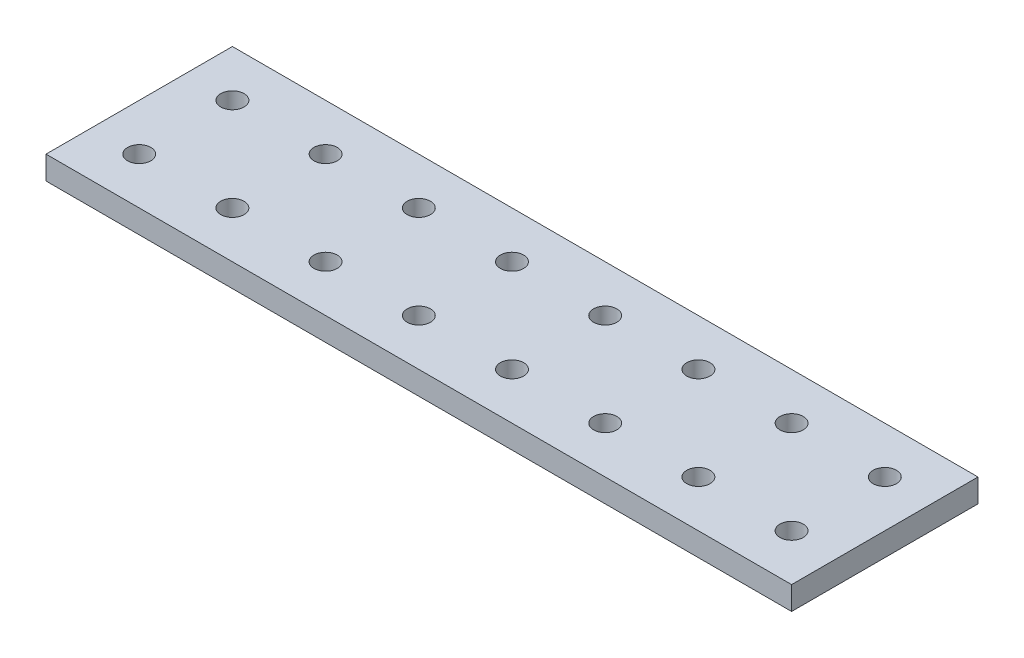
ISO-10303-21;
HEADER;
FILE_DESCRIPTION(('STEP AP214'),'2;1');
FILE_NAME('part.step','',(''),(''),'','','');
FILE_SCHEMA(('AUTOMOTIVE_DESIGN { 1 0 10303 214 1 1 1 1 }'));
ENDSEC;
DATA;
#1=APPLICATION_CONTEXT('core data for automotive mechanical design processes');
#2=APPLICATION_PROTOCOL_DEFINITION('international standard','automotive_design',2000,#1);
#3=PRODUCT_CONTEXT('',#1,'mechanical');
#4=PRODUCT('Part','Part','',(#3));
#5=PRODUCT_RELATED_PRODUCT_CATEGORY('part','',(#4));
#6=PRODUCT_DEFINITION_FORMATION('','',#4);
#7=PRODUCT_DEFINITION_CONTEXT('part definition',#1,'design');
#8=PRODUCT_DEFINITION('design','',#6,#7);
#9=PRODUCT_DEFINITION_SHAPE('','',#8);
#10=(LENGTH_UNIT() NAMED_UNIT(*) SI_UNIT(.MILLI.,.METRE.));
#11=(NAMED_UNIT(*) PLANE_ANGLE_UNIT() SI_UNIT($,.RADIAN.));
#12=(NAMED_UNIT(*) SI_UNIT($,.STERADIAN.) SOLID_ANGLE_UNIT());
#13=UNCERTAINTY_MEASURE_WITH_UNIT(LENGTH_MEASURE(1.E-05),#10,'distance_accuracy_value','');
#14=(GEOMETRIC_REPRESENTATION_CONTEXT(3) GLOBAL_UNCERTAINTY_ASSIGNED_CONTEXT((#13)) GLOBAL_UNIT_ASSIGNED_CONTEXT((#10,
#11,#12)) REPRESENTATION_CONTEXT('',''));
#15=CARTESIAN_POINT('',(0.,0.,0.));
#16=DIRECTION('',(0.,0.,1.));
#17=DIRECTION('',(1.,0.,0.));
#18=AXIS2_PLACEMENT_3D('',#15,#16,#17);
#19=CARTESIAN_POINT('',(0.,6.35,0.));
#20=DIRECTION('',(0.,-1.,0.));
#21=DIRECTION('',(0.,0.,-1.));
#22=AXIS2_PLACEMENT_3D('',#19,#20,#21);
#23=PLANE('',#22);
#24=DIRECTION('',(0.,0.,-1.));
#25=VECTOR('',#24,1.);
#26=CARTESIAN_POINT('',(101.6,6.35,25.4));
#27=LINE('',#26,#25);
#28=CARTESIAN_POINT('',(101.6,6.35,25.4));
#29=VERTEX_POINT('',#28);
#30=CARTESIAN_POINT('',(101.6,6.35,-25.4));
#31=VERTEX_POINT('',#30);
#32=EDGE_CURVE('E87',#29,#31,#27,.T.);
#33=ORIENTED_EDGE('',*,*,#32,.T.);
#34=DIRECTION('',(-1.,0.,0.));
#35=VECTOR('',#34,1.);
#36=CARTESIAN_POINT('',(-101.6,6.35,-25.4));
#37=LINE('',#36,#35);
#38=CARTESIAN_POINT('',(-101.6,6.35,-25.4));
#39=VERTEX_POINT('',#38);
#40=EDGE_CURVE('E82',#31,#39,#37,.T.);
#41=ORIENTED_EDGE('',*,*,#40,.T.);
#42=DIRECTION('',(0.,0.,1.));
#43=VECTOR('',#42,1.);
#44=CARTESIAN_POINT('',(-101.6,6.35,25.4));
#45=LINE('',#44,#43);
#46=CARTESIAN_POINT('',(-101.6,6.35,25.4));
#47=VERTEX_POINT('',#46);
#48=EDGE_CURVE('E85',#39,#47,#45,.T.);
#49=ORIENTED_EDGE('',*,*,#48,.T.);
#50=DIRECTION('',(1.,0.,0.));
#51=VECTOR('',#50,1.);
#52=CARTESIAN_POINT('',(-101.6,6.35,25.4));
#53=LINE('',#52,#51);
#54=EDGE_CURVE('E52',#47,#29,#53,.T.);
#55=ORIENTED_EDGE('',*,*,#54,.T.);
#56=EDGE_LOOP('',(#33,#41,#49,#55));
#57=FACE_BOUND('',#56,.T.);
#58=CARTESIAN_POINT('',(-88.9,6.35,-12.7));
#59=DIRECTION('',(0.,1.,0.));
#60=DIRECTION('',(0.,0.,1.));
#61=AXIS2_PLACEMENT_3D('',#58,#59,#60);
#62=CIRCLE('',#61,3.175);
#63=CARTESIAN_POINT('',(-88.9,6.35,-9.525));
#64=VERTEX_POINT('',#63);
#65=EDGE_CURVE('E102',#64,#64,#62,.T.);
#66=ORIENTED_EDGE('',*,*,#65,.F.);
#67=EDGE_LOOP('',(#66));
#68=FACE_BOUND('',#67,.T.);
#69=CARTESIAN_POINT('',(-63.5,6.35,-12.7));
#70=DIRECTION('',(0.,1.,0.));
#71=DIRECTION('',(0.,0.,1.));
#72=AXIS2_PLACEMENT_3D('',#69,#70,#71);
#73=CIRCLE('',#72,3.17499999999999);
#74=CARTESIAN_POINT('',(-63.5,6.35,-9.52500000000001));
#75=VERTEX_POINT('',#74);
#76=EDGE_CURVE('E117',#75,#75,#73,.T.);
#77=ORIENTED_EDGE('',*,*,#76,.F.);
#78=EDGE_LOOP('',(#77));
#79=FACE_BOUND('',#78,.T.);
#80=CARTESIAN_POINT('',(-38.1,6.35,-12.7));
#81=DIRECTION('',(0.,1.,0.));
#82=DIRECTION('',(0.,0.,1.));
#83=AXIS2_PLACEMENT_3D('',#80,#81,#82);
#84=CIRCLE('',#83,3.175);
#85=CARTESIAN_POINT('',(-38.1,6.35,-9.525));
#86=VERTEX_POINT('',#85);
#87=EDGE_CURVE('E123',#86,#86,#84,.T.);
#88=ORIENTED_EDGE('',*,*,#87,.F.);
#89=EDGE_LOOP('',(#88));
#90=FACE_BOUND('',#89,.T.);
#91=CARTESIAN_POINT('',(-12.7,6.35,-12.7));
#92=DIRECTION('',(0.,1.,0.));
#93=DIRECTION('',(0.,0.,1.));
#94=AXIS2_PLACEMENT_3D('',#91,#92,#93);
#95=CIRCLE('',#94,3.175);
#96=CARTESIAN_POINT('',(-12.7,6.35,-9.525));
#97=VERTEX_POINT('',#96);
#98=EDGE_CURVE('E129',#97,#97,#95,.T.);
#99=ORIENTED_EDGE('',*,*,#98,.F.);
#100=EDGE_LOOP('',(#99));
#101=FACE_BOUND('',#100,.T.);
#102=CARTESIAN_POINT('',(12.7,6.35,-12.7));
#103=DIRECTION('',(0.,1.,0.));
#104=DIRECTION('',(0.,0.,1.));
#105=AXIS2_PLACEMENT_3D('',#102,#103,#104);
#106=CIRCLE('',#105,3.175);
#107=CARTESIAN_POINT('',(12.7,6.35,-9.525));
#108=VERTEX_POINT('',#107);
#109=EDGE_CURVE('E135',#108,#108,#106,.T.);
#110=ORIENTED_EDGE('',*,*,#109,.F.);
#111=EDGE_LOOP('',(#110));
#112=FACE_BOUND('',#111,.T.);
#113=CARTESIAN_POINT('',(38.1,6.35,-12.7));
#114=DIRECTION('',(0.,1.,0.));
#115=DIRECTION('',(0.,0.,1.));
#116=AXIS2_PLACEMENT_3D('',#113,#114,#115);
#117=CIRCLE('',#116,3.175);
#118=CARTESIAN_POINT('',(38.1,6.35,-9.525));
#119=VERTEX_POINT('',#118);
#120=EDGE_CURVE('E141',#119,#119,#117,.T.);
#121=ORIENTED_EDGE('',*,*,#120,.F.);
#122=EDGE_LOOP('',(#121));
#123=FACE_BOUND('',#122,.T.);
#124=CARTESIAN_POINT('',(63.5,6.35,-12.7));
#125=DIRECTION('',(0.,1.,0.));
#126=DIRECTION('',(0.,0.,1.));
#127=AXIS2_PLACEMENT_3D('',#124,#125,#126);
#128=CIRCLE('',#127,3.175);
#129=CARTESIAN_POINT('',(63.5,6.35,-9.525));
#130=VERTEX_POINT('',#129);
#131=EDGE_CURVE('E147',#130,#130,#128,.T.);
#132=ORIENTED_EDGE('',*,*,#131,.F.);
#133=EDGE_LOOP('',(#132));
#134=FACE_BOUND('',#133,.T.);
#135=CARTESIAN_POINT('',(88.9,6.35,-12.7));
#136=DIRECTION('',(0.,1.,0.));
#137=DIRECTION('',(0.,0.,1.));
#138=AXIS2_PLACEMENT_3D('',#135,#136,#137);
#139=CIRCLE('',#138,3.175);
#140=CARTESIAN_POINT('',(88.9,6.35,-9.525));
#141=VERTEX_POINT('',#140);
#142=EDGE_CURVE('E153',#141,#141,#139,.T.);
#143=ORIENTED_EDGE('',*,*,#142,.F.);
#144=EDGE_LOOP('',(#143));
#145=FACE_BOUND('',#144,.T.);
#146=CARTESIAN_POINT('',(-63.4999999999997,6.35,12.7));
#147=DIRECTION('',(0.,1.,0.));
#148=DIRECTION('',(0.,0.,1.));
#149=AXIS2_PLACEMENT_3D('',#146,#147,#148);
#150=CIRCLE('',#149,3.175);
#151=CARTESIAN_POINT('',(-63.4999999999997,6.35,15.875));
#152=VERTEX_POINT('',#151);
#153=EDGE_CURVE('E159',#152,#152,#150,.T.);
#154=ORIENTED_EDGE('',*,*,#153,.F.);
#155=EDGE_LOOP('',(#154));
#156=FACE_BOUND('',#155,.T.);
#157=CARTESIAN_POINT('',(-38.0999999999997,6.35,12.7));
#158=DIRECTION('',(0.,1.,0.));
#159=DIRECTION('',(0.,0.,1.));
#160=AXIS2_PLACEMENT_3D('',#157,#158,#159);
#161=CIRCLE('',#160,3.175);
#162=CARTESIAN_POINT('',(-38.0999999999997,6.35,15.875));
#163=VERTEX_POINT('',#162);
#164=EDGE_CURVE('E165',#163,#163,#161,.T.);
#165=ORIENTED_EDGE('',*,*,#164,.F.);
#166=EDGE_LOOP('',(#165));
#167=FACE_BOUND('',#166,.T.);
#168=CARTESIAN_POINT('',(-12.6999999999998,6.35,12.7));
#169=DIRECTION('',(0.,1.,0.));
#170=DIRECTION('',(0.,0.,1.));
#171=AXIS2_PLACEMENT_3D('',#168,#169,#170);
#172=CIRCLE('',#171,3.175);
#173=CARTESIAN_POINT('',(-12.6999999999998,6.35,15.875));
#174=VERTEX_POINT('',#173);
#175=EDGE_CURVE('E171',#174,#174,#172,.T.);
#176=ORIENTED_EDGE('',*,*,#175,.F.);
#177=EDGE_LOOP('',(#176));
#178=FACE_BOUND('',#177,.T.);
#179=CARTESIAN_POINT('',(12.7000000000003,6.35,12.7));
#180=DIRECTION('',(0.,1.,0.));
#181=DIRECTION('',(0.,0.,1.));
#182=AXIS2_PLACEMENT_3D('',#179,#180,#181);
#183=CIRCLE('',#182,3.175);
#184=CARTESIAN_POINT('',(12.7000000000003,6.35,15.875));
#185=VERTEX_POINT('',#184);
#186=EDGE_CURVE('E177',#185,#185,#183,.T.);
#187=ORIENTED_EDGE('',*,*,#186,.F.);
#188=EDGE_LOOP('',(#187));
#189=FACE_BOUND('',#188,.T.);
#190=CARTESIAN_POINT('',(38.1000000000003,6.35,12.7));
#191=DIRECTION('',(0.,1.,0.));
#192=DIRECTION('',(0.,0.,1.));
#193=AXIS2_PLACEMENT_3D('',#190,#191,#192);
#194=CIRCLE('',#193,3.175);
#195=CARTESIAN_POINT('',(38.1000000000003,6.35,15.875));
#196=VERTEX_POINT('',#195);
#197=EDGE_CURVE('E183',#196,#196,#194,.T.);
#198=ORIENTED_EDGE('',*,*,#197,.F.);
#199=EDGE_LOOP('',(#198));
#200=FACE_BOUND('',#199,.T.);
#201=CARTESIAN_POINT('',(63.5000000000002,6.35,12.7));
#202=DIRECTION('',(0.,1.,0.));
#203=DIRECTION('',(0.,0.,1.));
#204=AXIS2_PLACEMENT_3D('',#201,#202,#203);
#205=CIRCLE('',#204,3.175);
#206=CARTESIAN_POINT('',(63.5000000000002,6.35,15.875));
#207=VERTEX_POINT('',#206);
#208=EDGE_CURVE('E189',#207,#207,#205,.T.);
#209=ORIENTED_EDGE('',*,*,#208,.F.);
#210=EDGE_LOOP('',(#209));
#211=FACE_BOUND('',#210,.T.);
#212=CARTESIAN_POINT('',(88.9000000000003,6.35,12.7));
#213=DIRECTION('',(0.,1.,0.));
#214=DIRECTION('',(0.,0.,1.));
#215=AXIS2_PLACEMENT_3D('',#212,#213,#214);
#216=CIRCLE('',#215,3.175);
#217=CARTESIAN_POINT('',(88.9000000000003,6.35,15.875));
#218=VERTEX_POINT('',#217);
#219=EDGE_CURVE('E195',#218,#218,#216,.T.);
#220=ORIENTED_EDGE('',*,*,#219,.F.);
#221=EDGE_LOOP('',(#220));
#222=FACE_BOUND('',#221,.T.);
#223=CARTESIAN_POINT('',(-88.8999999999997,6.35,12.7));
#224=DIRECTION('',(0.,1.,0.));
#225=DIRECTION('',(0.,0.,1.));
#226=AXIS2_PLACEMENT_3D('',#223,#224,#225);
#227=CIRCLE('',#226,3.175);
#228=CARTESIAN_POINT('',(-88.8999999999997,6.35,15.875));
#229=VERTEX_POINT('',#228);
#230=EDGE_CURVE('E201',#229,#229,#227,.T.);
#231=ORIENTED_EDGE('',*,*,#230,.F.);
#232=EDGE_LOOP('',(#231));
#233=FACE_BOUND('',#232,.T.);
#234=ADVANCED_FACE('F35',(#57,#68,#79,#90,#101,#112,#123,#134,#145,#156,#167,#178,#189,#200,
#211,#222,#233),#23,.F.);
#235=CARTESIAN_POINT('',(0.,0.,0.));
#236=DIRECTION('',(0.,-1.,0.));
#237=DIRECTION('',(0.,0.,-1.));
#238=AXIS2_PLACEMENT_3D('',#235,#236,#237);
#239=PLANE('',#238);
#240=CARTESIAN_POINT('',(88.9000000000003,0.,12.7));
#241=DIRECTION('',(0.,1.,0.));
#242=DIRECTION('',(0.,0.,1.));
#243=AXIS2_PLACEMENT_3D('',#240,#241,#242);
#244=CIRCLE('',#243,3.175);
#245=CARTESIAN_POINT('',(88.9000000000003,0.,15.875));
#246=VERTEX_POINT('',#245);
#247=EDGE_CURVE('E198',#246,#246,#244,.T.);
#248=ORIENTED_EDGE('',*,*,#247,.T.);
#249=EDGE_LOOP('',(#248));
#250=FACE_BOUND('',#249,.T.);
#251=CARTESIAN_POINT('',(38.1000000000003,0.,12.7));
#252=DIRECTION('',(0.,1.,0.));
#253=DIRECTION('',(0.,0.,1.));
#254=AXIS2_PLACEMENT_3D('',#251,#252,#253);
#255=CIRCLE('',#254,3.175);
#256=CARTESIAN_POINT('',(38.1000000000003,0.,15.875));
#257=VERTEX_POINT('',#256);
#258=EDGE_CURVE('E186',#257,#257,#255,.T.);
#259=ORIENTED_EDGE('',*,*,#258,.T.);
#260=EDGE_LOOP('',(#259));
#261=FACE_BOUND('',#260,.T.);
#262=CARTESIAN_POINT('',(-12.6999999999998,0.,12.7));
#263=DIRECTION('',(0.,1.,0.));
#264=DIRECTION('',(0.,0.,1.));
#265=AXIS2_PLACEMENT_3D('',#262,#263,#264);
#266=CIRCLE('',#265,3.175);
#267=CARTESIAN_POINT('',(-12.6999999999998,0.,15.875));
#268=VERTEX_POINT('',#267);
#269=EDGE_CURVE('E174',#268,#268,#266,.T.);
#270=ORIENTED_EDGE('',*,*,#269,.T.);
#271=EDGE_LOOP('',(#270));
#272=FACE_BOUND('',#271,.T.);
#273=CARTESIAN_POINT('',(-63.4999999999997,0.,12.7));
#274=DIRECTION('',(0.,1.,0.));
#275=DIRECTION('',(0.,0.,1.));
#276=AXIS2_PLACEMENT_3D('',#273,#274,#275);
#277=CIRCLE('',#276,3.175);
#278=CARTESIAN_POINT('',(-63.4999999999997,0.,15.875));
#279=VERTEX_POINT('',#278);
#280=EDGE_CURVE('E162',#279,#279,#277,.T.);
#281=ORIENTED_EDGE('',*,*,#280,.T.);
#282=EDGE_LOOP('',(#281));
#283=FACE_BOUND('',#282,.T.);
#284=CARTESIAN_POINT('',(63.5,0.,-12.7));
#285=DIRECTION('',(0.,1.,0.));
#286=DIRECTION('',(0.,0.,1.));
#287=AXIS2_PLACEMENT_3D('',#284,#285,#286);
#288=CIRCLE('',#287,3.175);
#289=CARTESIAN_POINT('',(63.5,0.,-9.525));
#290=VERTEX_POINT('',#289);
#291=EDGE_CURVE('E150',#290,#290,#288,.T.);
#292=ORIENTED_EDGE('',*,*,#291,.T.);
#293=EDGE_LOOP('',(#292));
#294=FACE_BOUND('',#293,.T.);
#295=CARTESIAN_POINT('',(12.7,0.,-12.7));
#296=DIRECTION('',(0.,1.,0.));
#297=DIRECTION('',(0.,0.,1.));
#298=AXIS2_PLACEMENT_3D('',#295,#296,#297);
#299=CIRCLE('',#298,3.175);
#300=CARTESIAN_POINT('',(12.7,0.,-9.525));
#301=VERTEX_POINT('',#300);
#302=EDGE_CURVE('E138',#301,#301,#299,.T.);
#303=ORIENTED_EDGE('',*,*,#302,.T.);
#304=EDGE_LOOP('',(#303));
#305=FACE_BOUND('',#304,.T.);
#306=CARTESIAN_POINT('',(-38.1,0.,-12.7));
#307=DIRECTION('',(0.,1.,0.));
#308=DIRECTION('',(0.,0.,1.));
#309=AXIS2_PLACEMENT_3D('',#306,#307,#308);
#310=CIRCLE('',#309,3.175);
#311=CARTESIAN_POINT('',(-38.1,0.,-9.525));
#312=VERTEX_POINT('',#311);
#313=EDGE_CURVE('E126',#312,#312,#310,.T.);
#314=ORIENTED_EDGE('',*,*,#313,.T.);
#315=EDGE_LOOP('',(#314));
#316=FACE_BOUND('',#315,.T.);
#317=CARTESIAN_POINT('',(-88.9,0.,-12.7));
#318=DIRECTION('',(0.,1.,0.));
#319=DIRECTION('',(0.,0.,1.));
#320=AXIS2_PLACEMENT_3D('',#317,#318,#319);
#321=CIRCLE('',#320,3.175);
#322=CARTESIAN_POINT('',(-88.9,0.,-9.525));
#323=VERTEX_POINT('',#322);
#324=EDGE_CURVE('E114',#323,#323,#321,.T.);
#325=ORIENTED_EDGE('',*,*,#324,.T.);
#326=EDGE_LOOP('',(#325));
#327=FACE_BOUND('',#326,.T.);
#328=DIRECTION('',(0.,0.,-1.));
#329=VECTOR('',#328,1.);
#330=CARTESIAN_POINT('',(101.6,0.,25.4));
#331=LINE('',#330,#329);
#332=CARTESIAN_POINT('',(101.6,0.,25.4));
#333=VERTEX_POINT('',#332);
#334=CARTESIAN_POINT('',(101.6,0.,-25.4));
#335=VERTEX_POINT('',#334);
#336=EDGE_CURVE('E99',#333,#335,#331,.T.);
#337=ORIENTED_EDGE('',*,*,#336,.F.);
#338=DIRECTION('',(1.,0.,0.));
#339=VECTOR('',#338,1.);
#340=CARTESIAN_POINT('',(-101.6,0.,25.4));
#341=LINE('',#340,#339);
#342=CARTESIAN_POINT('',(-101.6,0.,25.4));
#343=VERTEX_POINT('',#342);
#344=EDGE_CURVE('E75',#343,#333,#341,.T.);
#345=ORIENTED_EDGE('',*,*,#344,.F.);
#346=DIRECTION('',(0.,0.,1.));
#347=VECTOR('',#346,1.);
#348=CARTESIAN_POINT('',(-101.6,0.,25.4));
#349=LINE('',#348,#347);
#350=CARTESIAN_POINT('',(-101.6,0.,-25.4));
#351=VERTEX_POINT('',#350);
#352=EDGE_CURVE('E69',#351,#343,#349,.T.);
#353=ORIENTED_EDGE('',*,*,#352,.F.);
#354=DIRECTION('',(-1.,0.,0.));
#355=VECTOR('',#354,1.);
#356=CARTESIAN_POINT('',(-101.6,0.,-25.4));
#357=LINE('',#356,#355);
#358=EDGE_CURVE('E91',#335,#351,#357,.T.);
#359=ORIENTED_EDGE('',*,*,#358,.F.);
#360=EDGE_LOOP('',(#337,#345,#353,#359));
#361=FACE_BOUND('',#360,.T.);
#362=CARTESIAN_POINT('',(-63.5,0.,-12.7));
#363=DIRECTION('',(0.,1.,0.));
#364=DIRECTION('',(0.,0.,1.));
#365=AXIS2_PLACEMENT_3D('',#362,#363,#364);
#366=CIRCLE('',#365,3.17499999999999);
#367=CARTESIAN_POINT('',(-63.5,0.,-9.52500000000001));
#368=VERTEX_POINT('',#367);
#369=EDGE_CURVE('E120',#368,#368,#366,.T.);
#370=ORIENTED_EDGE('',*,*,#369,.T.);
#371=EDGE_LOOP('',(#370));
#372=FACE_BOUND('',#371,.T.);
#373=CARTESIAN_POINT('',(-12.7,0.,-12.7));
#374=DIRECTION('',(0.,1.,0.));
#375=DIRECTION('',(0.,0.,1.));
#376=AXIS2_PLACEMENT_3D('',#373,#374,#375);
#377=CIRCLE('',#376,3.175);
#378=CARTESIAN_POINT('',(-12.7,0.,-9.525));
#379=VERTEX_POINT('',#378);
#380=EDGE_CURVE('E132',#379,#379,#377,.T.);
#381=ORIENTED_EDGE('',*,*,#380,.T.);
#382=EDGE_LOOP('',(#381));
#383=FACE_BOUND('',#382,.T.);
#384=CARTESIAN_POINT('',(38.1,0.,-12.7));
#385=DIRECTION('',(0.,1.,0.));
#386=DIRECTION('',(0.,0.,1.));
#387=AXIS2_PLACEMENT_3D('',#384,#385,#386);
#388=CIRCLE('',#387,3.175);
#389=CARTESIAN_POINT('',(38.1,0.,-9.525));
#390=VERTEX_POINT('',#389);
#391=EDGE_CURVE('E144',#390,#390,#388,.T.);
#392=ORIENTED_EDGE('',*,*,#391,.T.);
#393=EDGE_LOOP('',(#392));
#394=FACE_BOUND('',#393,.T.);
#395=CARTESIAN_POINT('',(88.9,0.,-12.7));
#396=DIRECTION('',(0.,1.,0.));
#397=DIRECTION('',(0.,0.,1.));
#398=AXIS2_PLACEMENT_3D('',#395,#396,#397);
#399=CIRCLE('',#398,3.175);
#400=CARTESIAN_POINT('',(88.9,0.,-9.525));
#401=VERTEX_POINT('',#400);
#402=EDGE_CURVE('E156',#401,#401,#399,.T.);
#403=ORIENTED_EDGE('',*,*,#402,.T.);
#404=EDGE_LOOP('',(#403));
#405=FACE_BOUND('',#404,.T.);
#406=CARTESIAN_POINT('',(-38.0999999999997,0.,12.7));
#407=DIRECTION('',(0.,1.,0.));
#408=DIRECTION('',(0.,0.,1.));
#409=AXIS2_PLACEMENT_3D('',#406,#407,#408);
#410=CIRCLE('',#409,3.175);
#411=CARTESIAN_POINT('',(-38.0999999999997,0.,15.875));
#412=VERTEX_POINT('',#411);
#413=EDGE_CURVE('E168',#412,#412,#410,.T.);
#414=ORIENTED_EDGE('',*,*,#413,.T.);
#415=EDGE_LOOP('',(#414));
#416=FACE_BOUND('',#415,.T.);
#417=CARTESIAN_POINT('',(12.7000000000003,0.,12.7));
#418=DIRECTION('',(0.,1.,0.));
#419=DIRECTION('',(0.,0.,1.));
#420=AXIS2_PLACEMENT_3D('',#417,#418,#419);
#421=CIRCLE('',#420,3.175);
#422=CARTESIAN_POINT('',(12.7000000000003,0.,15.875));
#423=VERTEX_POINT('',#422);
#424=EDGE_CURVE('E180',#423,#423,#421,.T.);
#425=ORIENTED_EDGE('',*,*,#424,.T.);
#426=EDGE_LOOP('',(#425));
#427=FACE_BOUND('',#426,.T.);
#428=CARTESIAN_POINT('',(63.5000000000002,0.,12.7));
#429=DIRECTION('',(0.,1.,0.));
#430=DIRECTION('',(0.,0.,1.));
#431=AXIS2_PLACEMENT_3D('',#428,#429,#430);
#432=CIRCLE('',#431,3.175);
#433=CARTESIAN_POINT('',(63.5000000000002,0.,15.875));
#434=VERTEX_POINT('',#433);
#435=EDGE_CURVE('E192',#434,#434,#432,.T.);
#436=ORIENTED_EDGE('',*,*,#435,.T.);
#437=EDGE_LOOP('',(#436));
#438=FACE_BOUND('',#437,.T.);
#439=CARTESIAN_POINT('',(-88.8999999999997,0.,12.7));
#440=DIRECTION('',(0.,1.,0.));
#441=DIRECTION('',(0.,0.,1.));
#442=AXIS2_PLACEMENT_3D('',#439,#440,#441);
#443=CIRCLE('',#442,3.175);
#444=CARTESIAN_POINT('',(-88.8999999999997,0.,15.875));
#445=VERTEX_POINT('',#444);
#446=EDGE_CURVE('E204',#445,#445,#443,.T.);
#447=ORIENTED_EDGE('',*,*,#446,.T.);
#448=EDGE_LOOP('',(#447));
#449=FACE_BOUND('',#448,.T.);
#450=ADVANCED_FACE('F110',(#250,#261,#272,#283,#294,#305,#316,#327,#361,#372,#383,#394,#405,
#416,#427,#438,#449),#239,.T.);
#451=CARTESIAN_POINT('',(101.6,6.35,25.4));
#452=DIRECTION('',(-1.,0.,0.));
#453=DIRECTION('',(0.,0.,1.));
#454=AXIS2_PLACEMENT_3D('',#451,#452,#453);
#455=PLANE('',#454);
#456=ORIENTED_EDGE('',*,*,#336,.T.);
#457=DIRECTION('',(0.,-1.,0.));
#458=VECTOR('',#457,1.);
#459=CARTESIAN_POINT('',(101.6,6.35,-25.4));
#460=LINE('',#459,#458);
#461=EDGE_CURVE('E11',#31,#335,#460,.T.);
#462=ORIENTED_EDGE('',*,*,#461,.F.);
#463=ORIENTED_EDGE('',*,*,#32,.F.);
#464=DIRECTION('',(0.,-1.,0.));
#465=VECTOR('',#464,1.);
#466=CARTESIAN_POINT('',(101.6,6.35,25.4));
#467=LINE('',#466,#465);
#468=EDGE_CURVE('E95',#29,#333,#467,.T.);
#469=ORIENTED_EDGE('',*,*,#468,.T.);
#470=EDGE_LOOP('',(#456,#462,#463,#469));
#471=FACE_BOUND('',#470,.T.);
#472=ADVANCED_FACE('F37',(#471),#455,.F.);
#473=CARTESIAN_POINT('',(-101.6,6.35,-25.4));
#474=DIRECTION('',(0.,0.,1.));
#475=DIRECTION('',(1.,0.,0.));
#476=AXIS2_PLACEMENT_3D('',#473,#474,#475);
#477=PLANE('',#476);
#478=ORIENTED_EDGE('',*,*,#358,.T.);
#479=DIRECTION('',(0.,-1.,0.));
#480=VECTOR('',#479,1.);
#481=CARTESIAN_POINT('',(-101.6,6.35,-25.4));
#482=LINE('',#481,#480);
#483=EDGE_CURVE('E44',#39,#351,#482,.T.);
#484=ORIENTED_EDGE('',*,*,#483,.F.);
#485=ORIENTED_EDGE('',*,*,#40,.F.);
#486=ORIENTED_EDGE('',*,*,#461,.T.);
#487=EDGE_LOOP('',(#478,#484,#485,#486));
#488=FACE_BOUND('',#487,.T.);
#489=ADVANCED_FACE('F90',(#488),#477,.F.);
#490=CARTESIAN_POINT('',(-101.6,6.35,25.4));
#491=DIRECTION('',(1.,0.,0.));
#492=DIRECTION('',(0.,0.,-1.));
#493=AXIS2_PLACEMENT_3D('',#490,#491,#492);
#494=PLANE('',#493);
#495=ORIENTED_EDGE('',*,*,#352,.T.);
#496=DIRECTION('',(0.,-1.,0.));
#497=VECTOR('',#496,1.);
#498=CARTESIAN_POINT('',(-101.6,6.35,25.4));
#499=LINE('',#498,#497);
#500=EDGE_CURVE('E92',#47,#343,#499,.T.);
#501=ORIENTED_EDGE('',*,*,#500,.F.);
#502=ORIENTED_EDGE('',*,*,#48,.F.);
#503=ORIENTED_EDGE('',*,*,#483,.T.);
#504=EDGE_LOOP('',(#495,#501,#502,#503));
#505=FACE_BOUND('',#504,.T.);
#506=ADVANCED_FACE('F93',(#505),#494,.F.);
#507=CARTESIAN_POINT('',(-101.6,6.35,25.4));
#508=DIRECTION('',(0.,0.,-1.));
#509=DIRECTION('',(-1.,0.,0.));
#510=AXIS2_PLACEMENT_3D('',#507,#508,#509);
#511=PLANE('',#510);
#512=ORIENTED_EDGE('',*,*,#344,.T.);
#513=ORIENTED_EDGE('',*,*,#468,.F.);
#514=ORIENTED_EDGE('',*,*,#54,.F.);
#515=ORIENTED_EDGE('',*,*,#500,.T.);
#516=EDGE_LOOP('',(#512,#513,#514,#515));
#517=FACE_BOUND('',#516,.T.);
#518=ADVANCED_FACE('F107',(#517),#511,.F.);
#519=CARTESIAN_POINT('',(-88.9,6.35,-12.7));
#520=DIRECTION('',(0.,-1.,0.));
#521=DIRECTION('',(0.,0.,-1.));
#522=AXIS2_PLACEMENT_3D('',#519,#520,#521);
#523=CYLINDRICAL_SURFACE('',#522,3.175);
#524=ORIENTED_EDGE('',*,*,#65,.T.);
#525=EDGE_LOOP('',(#524));
#526=FACE_BOUND('',#525,.T.);
#527=ORIENTED_EDGE('',*,*,#324,.F.);
#528=EDGE_LOOP('',(#527));
#529=FACE_BOUND('',#528,.T.);
#530=ADVANCED_FACE('F221',(#526,#529),#523,.F.);
#531=CARTESIAN_POINT('',(-63.5,6.35,-12.7));
#532=DIRECTION('',(0.,-1.,0.));
#533=DIRECTION('',(0.,0.,-1.));
#534=AXIS2_PLACEMENT_3D('',#531,#532,#533);
#535=CYLINDRICAL_SURFACE('',#534,3.17499999999999);
#536=ORIENTED_EDGE('',*,*,#76,.T.);
#537=EDGE_LOOP('',(#536));
#538=FACE_BOUND('',#537,.T.);
#539=ORIENTED_EDGE('',*,*,#369,.F.);
#540=EDGE_LOOP('',(#539));
#541=FACE_BOUND('',#540,.T.);
#542=ADVANCED_FACE('F267',(#538,#541),#535,.F.);
#543=CARTESIAN_POINT('',(-38.1,6.35,-12.7));
#544=DIRECTION('',(0.,-1.,0.));
#545=DIRECTION('',(0.,0.,-1.));
#546=AXIS2_PLACEMENT_3D('',#543,#544,#545);
#547=CYLINDRICAL_SURFACE('',#546,3.175);
#548=ORIENTED_EDGE('',*,*,#87,.T.);
#549=EDGE_LOOP('',(#548));
#550=FACE_BOUND('',#549,.T.);
#551=ORIENTED_EDGE('',*,*,#313,.F.);
#552=EDGE_LOOP('',(#551));
#553=FACE_BOUND('',#552,.T.);
#554=ADVANCED_FACE('F275',(#550,#553),#547,.F.);
#555=CARTESIAN_POINT('',(-12.7,6.35,-12.7));
#556=DIRECTION('',(0.,-1.,0.));
#557=DIRECTION('',(0.,0.,-1.));
#558=AXIS2_PLACEMENT_3D('',#555,#556,#557);
#559=CYLINDRICAL_SURFACE('',#558,3.175);
#560=ORIENTED_EDGE('',*,*,#98,.T.);
#561=EDGE_LOOP('',(#560));
#562=FACE_BOUND('',#561,.T.);
#563=ORIENTED_EDGE('',*,*,#380,.F.);
#564=EDGE_LOOP('',(#563));
#565=FACE_BOUND('',#564,.T.);
#566=ADVANCED_FACE('F283',(#562,#565),#559,.F.);
#567=CARTESIAN_POINT('',(12.7,6.35,-12.7));
#568=DIRECTION('',(0.,-1.,0.));
#569=DIRECTION('',(0.,0.,-1.));
#570=AXIS2_PLACEMENT_3D('',#567,#568,#569);
#571=CYLINDRICAL_SURFACE('',#570,3.175);
#572=ORIENTED_EDGE('',*,*,#109,.T.);
#573=EDGE_LOOP('',(#572));
#574=FACE_BOUND('',#573,.T.);
#575=ORIENTED_EDGE('',*,*,#302,.F.);
#576=EDGE_LOOP('',(#575));
#577=FACE_BOUND('',#576,.T.);
#578=ADVANCED_FACE('F292',(#574,#577),#571,.F.);
#579=CARTESIAN_POINT('',(38.1,6.35,-12.7));
#580=DIRECTION('',(0.,-1.,0.));
#581=DIRECTION('',(0.,0.,-1.));
#582=AXIS2_PLACEMENT_3D('',#579,#580,#581);
#583=CYLINDRICAL_SURFACE('',#582,3.175);
#584=ORIENTED_EDGE('',*,*,#120,.T.);
#585=EDGE_LOOP('',(#584));
#586=FACE_BOUND('',#585,.T.);
#587=ORIENTED_EDGE('',*,*,#391,.F.);
#588=EDGE_LOOP('',(#587));
#589=FACE_BOUND('',#588,.T.);
#590=ADVANCED_FACE('F301',(#586,#589),#583,.F.);
#591=CARTESIAN_POINT('',(63.5,6.35,-12.7));
#592=DIRECTION('',(0.,-1.,0.));
#593=DIRECTION('',(0.,0.,-1.));
#594=AXIS2_PLACEMENT_3D('',#591,#592,#593);
#595=CYLINDRICAL_SURFACE('',#594,3.175);
#596=ORIENTED_EDGE('',*,*,#131,.T.);
#597=EDGE_LOOP('',(#596));
#598=FACE_BOUND('',#597,.T.);
#599=ORIENTED_EDGE('',*,*,#291,.F.);
#600=EDGE_LOOP('',(#599));
#601=FACE_BOUND('',#600,.T.);
#602=ADVANCED_FACE('F310',(#598,#601),#595,.F.);
#603=CARTESIAN_POINT('',(88.9,6.35,-12.7));
#604=DIRECTION('',(0.,-1.,0.));
#605=DIRECTION('',(0.,0.,-1.));
#606=AXIS2_PLACEMENT_3D('',#603,#604,#605);
#607=CYLINDRICAL_SURFACE('',#606,3.175);
#608=ORIENTED_EDGE('',*,*,#142,.T.);
#609=EDGE_LOOP('',(#608));
#610=FACE_BOUND('',#609,.T.);
#611=ORIENTED_EDGE('',*,*,#402,.F.);
#612=EDGE_LOOP('',(#611));
#613=FACE_BOUND('',#612,.T.);
#614=ADVANCED_FACE('F319',(#610,#613),#607,.F.);
#615=CARTESIAN_POINT('',(-63.4999999999997,6.35,12.7));
#616=DIRECTION('',(0.,-1.,0.));
#617=DIRECTION('',(0.,0.,-1.));
#618=AXIS2_PLACEMENT_3D('',#615,#616,#617);
#619=CYLINDRICAL_SURFACE('',#618,3.175);
#620=ORIENTED_EDGE('',*,*,#153,.T.);
#621=EDGE_LOOP('',(#620));
#622=FACE_BOUND('',#621,.T.);
#623=ORIENTED_EDGE('',*,*,#280,.F.);
#624=EDGE_LOOP('',(#623));
#625=FACE_BOUND('',#624,.T.);
#626=ADVANCED_FACE('F328',(#622,#625),#619,.F.);
#627=CARTESIAN_POINT('',(-38.0999999999997,6.35,12.7));
#628=DIRECTION('',(0.,-1.,0.));
#629=DIRECTION('',(0.,0.,-1.));
#630=AXIS2_PLACEMENT_3D('',#627,#628,#629);
#631=CYLINDRICAL_SURFACE('',#630,3.175);
#632=ORIENTED_EDGE('',*,*,#164,.T.);
#633=EDGE_LOOP('',(#632));
#634=FACE_BOUND('',#633,.T.);
#635=ORIENTED_EDGE('',*,*,#413,.F.);
#636=EDGE_LOOP('',(#635));
#637=FACE_BOUND('',#636,.T.);
#638=ADVANCED_FACE('F337',(#634,#637),#631,.F.);
#639=CARTESIAN_POINT('',(-12.6999999999998,6.35,12.7));
#640=DIRECTION('',(0.,-1.,0.));
#641=DIRECTION('',(0.,0.,-1.));
#642=AXIS2_PLACEMENT_3D('',#639,#640,#641);
#643=CYLINDRICAL_SURFACE('',#642,3.175);
#644=ORIENTED_EDGE('',*,*,#175,.T.);
#645=EDGE_LOOP('',(#644));
#646=FACE_BOUND('',#645,.T.);
#647=ORIENTED_EDGE('',*,*,#269,.F.);
#648=EDGE_LOOP('',(#647));
#649=FACE_BOUND('',#648,.T.);
#650=ADVANCED_FACE('F346',(#646,#649),#643,.F.);
#651=CARTESIAN_POINT('',(12.7000000000003,6.35,12.7));
#652=DIRECTION('',(0.,-1.,0.));
#653=DIRECTION('',(0.,0.,-1.));
#654=AXIS2_PLACEMENT_3D('',#651,#652,#653);
#655=CYLINDRICAL_SURFACE('',#654,3.175);
#656=ORIENTED_EDGE('',*,*,#186,.T.);
#657=EDGE_LOOP('',(#656));
#658=FACE_BOUND('',#657,.T.);
#659=ORIENTED_EDGE('',*,*,#424,.F.);
#660=EDGE_LOOP('',(#659));
#661=FACE_BOUND('',#660,.T.);
#662=ADVANCED_FACE('F355',(#658,#661),#655,.F.);
#663=CARTESIAN_POINT('',(38.1000000000003,6.35,12.7));
#664=DIRECTION('',(0.,-1.,0.));
#665=DIRECTION('',(0.,0.,-1.));
#666=AXIS2_PLACEMENT_3D('',#663,#664,#665);
#667=CYLINDRICAL_SURFACE('',#666,3.175);
#668=ORIENTED_EDGE('',*,*,#197,.T.);
#669=EDGE_LOOP('',(#668));
#670=FACE_BOUND('',#669,.T.);
#671=ORIENTED_EDGE('',*,*,#258,.F.);
#672=EDGE_LOOP('',(#671));
#673=FACE_BOUND('',#672,.T.);
#674=ADVANCED_FACE('F364',(#670,#673),#667,.F.);
#675=CARTESIAN_POINT('',(63.5000000000002,6.35,12.7));
#676=DIRECTION('',(0.,-1.,0.));
#677=DIRECTION('',(0.,0.,-1.));
#678=AXIS2_PLACEMENT_3D('',#675,#676,#677);
#679=CYLINDRICAL_SURFACE('',#678,3.175);
#680=ORIENTED_EDGE('',*,*,#208,.T.);
#681=EDGE_LOOP('',(#680));
#682=FACE_BOUND('',#681,.T.);
#683=ORIENTED_EDGE('',*,*,#435,.F.);
#684=EDGE_LOOP('',(#683));
#685=FACE_BOUND('',#684,.T.);
#686=ADVANCED_FACE('F373',(#682,#685),#679,.F.);
#687=CARTESIAN_POINT('',(88.9000000000003,6.35,12.7));
#688=DIRECTION('',(0.,-1.,0.));
#689=DIRECTION('',(0.,0.,-1.));
#690=AXIS2_PLACEMENT_3D('',#687,#688,#689);
#691=CYLINDRICAL_SURFACE('',#690,3.175);
#692=ORIENTED_EDGE('',*,*,#219,.T.);
#693=EDGE_LOOP('',(#692));
#694=FACE_BOUND('',#693,.T.);
#695=ORIENTED_EDGE('',*,*,#247,.F.);
#696=EDGE_LOOP('',(#695));
#697=FACE_BOUND('',#696,.T.);
#698=ADVANCED_FACE('F382',(#694,#697),#691,.F.);
#699=CARTESIAN_POINT('',(-88.8999999999997,6.35,12.7));
#700=DIRECTION('',(0.,-1.,0.));
#701=DIRECTION('',(0.,0.,-1.));
#702=AXIS2_PLACEMENT_3D('',#699,#700,#701);
#703=CYLINDRICAL_SURFACE('',#702,3.175);
#704=ORIENTED_EDGE('',*,*,#230,.T.);
#705=EDGE_LOOP('',(#704));
#706=FACE_BOUND('',#705,.T.);
#707=ORIENTED_EDGE('',*,*,#446,.F.);
#708=EDGE_LOOP('',(#707));
#709=FACE_BOUND('',#708,.T.);
#710=ADVANCED_FACE('F210',(#706,#709),#703,.F.);
#711=CLOSED_SHELL('',(#234,#450,#472,#489,#506,#518,#530,#542,#554,#566,#578,#590,#602,#614,
#626,#638,#650,#662,#674,#686,#698,#710));
#712=MANIFOLD_SOLID_BREP('B2',#711);
#713=ADVANCED_BREP_SHAPE_REPRESENTATION('',(#18,#712),#14);
#714=SHAPE_DEFINITION_REPRESENTATION(#9,#713);
ENDSEC;
END-ISO-10303-21;
